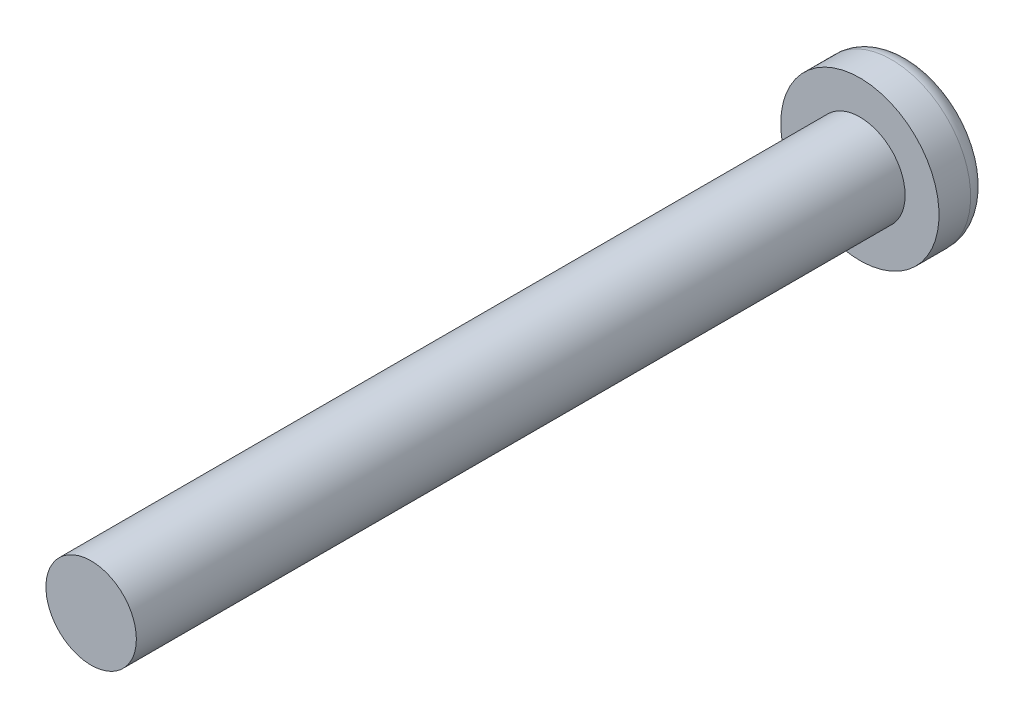
ISO-10303-21;
HEADER;
FILE_DESCRIPTION(('STEP AP214'),'2;1');
FILE_NAME('part.step','',(''),(''),'','','');
FILE_SCHEMA(('AUTOMOTIVE_DESIGN { 1 0 10303 214 1 1 1 1 }'));
ENDSEC;
DATA;
#1=APPLICATION_CONTEXT('core data for automotive mechanical design processes');
#2=APPLICATION_PROTOCOL_DEFINITION('international standard','automotive_design',2000,#1);
#3=PRODUCT_CONTEXT('',#1,'mechanical');
#4=PRODUCT('Part','Part','',(#3));
#5=PRODUCT_RELATED_PRODUCT_CATEGORY('part','',(#4));
#6=PRODUCT_DEFINITION_FORMATION('','',#4);
#7=PRODUCT_DEFINITION_CONTEXT('part definition',#1,'design');
#8=PRODUCT_DEFINITION('design','',#6,#7);
#9=PRODUCT_DEFINITION_SHAPE('','',#8);
#10=(LENGTH_UNIT() NAMED_UNIT(*) SI_UNIT(.MILLI.,.METRE.));
#11=(NAMED_UNIT(*) PLANE_ANGLE_UNIT() SI_UNIT($,.RADIAN.));
#12=(NAMED_UNIT(*) SI_UNIT($,.STERADIAN.) SOLID_ANGLE_UNIT());
#13=UNCERTAINTY_MEASURE_WITH_UNIT(LENGTH_MEASURE(1.E-05),#10,'distance_accuracy_value','');
#14=(GEOMETRIC_REPRESENTATION_CONTEXT(3) GLOBAL_UNCERTAINTY_ASSIGNED_CONTEXT((#13)) GLOBAL_UNIT_ASSIGNED_CONTEXT((#10,
#11,#12)) REPRESENTATION_CONTEXT('',''));
#15=CARTESIAN_POINT('',(0.,0.,0.));
#16=DIRECTION('',(0.,0.,1.));
#17=DIRECTION('',(1.,0.,0.));
#18=AXIS2_PLACEMENT_3D('',#15,#16,#17);
#19=CARTESIAN_POINT('',(0.,0.,85.));
#20=DIRECTION('',(0.,0.,-1.));
#21=DIRECTION('',(-1.,0.,0.));
#22=AXIS2_PLACEMENT_3D('',#19,#20,#21);
#23=CYLINDRICAL_SURFACE('',#22,5.);
#24=CARTESIAN_POINT('',(0.,0.,85.));
#25=DIRECTION('',(0.,0.,1.));
#26=DIRECTION('',(1.,0.,0.));
#27=AXIS2_PLACEMENT_3D('',#24,#25,#26);
#28=CIRCLE('',#27,5.);
#29=CARTESIAN_POINT('',(5.,0.,85.));
#30=VERTEX_POINT('',#29);
#31=EDGE_CURVE('E50',#30,#30,#28,.T.);
#32=ORIENTED_EDGE('',*,*,#31,.F.);
#33=EDGE_LOOP('',(#32));
#34=FACE_BOUND('',#33,.T.);
#35=CARTESIAN_POINT('',(0.,0.,0.));
#36=DIRECTION('',(0.,0.,1.));
#37=DIRECTION('',(1.,0.,0.));
#38=AXIS2_PLACEMENT_3D('',#35,#36,#37);
#39=CIRCLE('',#38,5.);
#40=CARTESIAN_POINT('',(5.,0.,0.));
#41=VERTEX_POINT('',#40);
#42=EDGE_CURVE('E55',#41,#41,#39,.T.);
#43=ORIENTED_EDGE('',*,*,#42,.T.);
#44=EDGE_LOOP('',(#43));
#45=FACE_BOUND('',#44,.T.);
#46=ADVANCED_FACE('F37',(#34,#45),#23,.T.);
#47=CARTESIAN_POINT('',(0.,0.,85.));
#48=DIRECTION('',(0.,0.,1.));
#49=DIRECTION('',(1.,0.,0.));
#50=AXIS2_PLACEMENT_3D('',#47,#48,#49);
#51=PLANE('',#50);
#52=ORIENTED_EDGE('',*,*,#31,.T.);
#53=EDGE_LOOP('',(#52));
#54=FACE_BOUND('',#53,.T.);
#55=ADVANCED_FACE('F82',(#54),#51,.T.);
#56=CARTESIAN_POINT('',(0.,0.,-5.5));
#57=DIRECTION('',(0.,0.,1.));
#58=DIRECTION('',(1.,0.,0.));
#59=AXIS2_PLACEMENT_3D('',#56,#57,#58);
#60=CYLINDRICAL_SURFACE('',#59,8.75);
#61=CARTESIAN_POINT('',(0.,0.,-3.5));
#62=DIRECTION('',(0.,0.,-1.));
#63=DIRECTION('',(-1.,0.,0.));
#64=AXIS2_PLACEMENT_3D('',#61,#62,#63);
#65=CIRCLE('',#64,8.75);
#66=CARTESIAN_POINT('',(-8.75,0.,-3.5));
#67=VERTEX_POINT('',#66);
#68=EDGE_CURVE('E10',#67,#67,#65,.F.);
#69=ORIENTED_EDGE('',*,*,#68,.T.);
#70=EDGE_LOOP('',(#69));
#71=FACE_BOUND('',#70,.T.);
#72=CARTESIAN_POINT('',(0.,0.,0.));
#73=DIRECTION('',(0.,0.,-1.));
#74=DIRECTION('',(-1.,0.,0.));
#75=AXIS2_PLACEMENT_3D('',#72,#73,#74);
#76=CIRCLE('',#75,8.75);
#77=CARTESIAN_POINT('',(-8.75,0.,0.));
#78=VERTEX_POINT('',#77);
#79=EDGE_CURVE('E60',#78,#78,#76,.T.);
#80=ORIENTED_EDGE('',*,*,#79,.T.);
#81=EDGE_LOOP('',(#80));
#82=FACE_BOUND('',#81,.T.);
#83=ADVANCED_FACE('F66',(#71,#82),#60,.T.);
#84=CARTESIAN_POINT('',(0.,0.,-5.5));
#85=DIRECTION('',(0.,0.,-1.));
#86=DIRECTION('',(-1.,0.,0.));
#87=AXIS2_PLACEMENT_3D('',#84,#85,#86);
#88=PLANE('',#87);
#89=CARTESIAN_POINT('',(0.,0.,-5.5));
#90=DIRECTION('',(0.,0.,-1.));
#91=DIRECTION('',(-1.,0.,0.));
#92=AXIS2_PLACEMENT_3D('',#89,#90,#91);
#93=CIRCLE('',#92,6.75);
#94=CARTESIAN_POINT('',(-6.75,0.,-5.5));
#95=VERTEX_POINT('',#94);
#96=EDGE_CURVE('E45',#95,#95,#93,.T.);
#97=ORIENTED_EDGE('',*,*,#96,.T.);
#98=EDGE_LOOP('',(#97));
#99=FACE_BOUND('',#98,.T.);
#100=ADVANCED_FACE('F70',(#99),#88,.T.);
#101=CARTESIAN_POINT('',(0.,0.,0.));
#102=DIRECTION('',(0.,0.,-1.));
#103=DIRECTION('',(-1.,0.,0.));
#104=AXIS2_PLACEMENT_3D('',#101,#102,#103);
#105=PLANE('',#104);
#106=ORIENTED_EDGE('',*,*,#42,.F.);
#107=EDGE_LOOP('',(#106));
#108=FACE_BOUND('',#107,.T.);
#109=ORIENTED_EDGE('',*,*,#79,.F.);
#110=EDGE_LOOP('',(#109));
#111=FACE_BOUND('',#110,.T.);
#112=ADVANCED_FACE('F68',(#108,#111),#105,.F.);
#113=CARTESIAN_POINT('',(0.,0.,-3.5));
#114=DIRECTION('',(0.,0.,-1.));
#115=DIRECTION('',(-1.,0.,0.));
#116=AXIS2_PLACEMENT_3D('',#113,#114,#115);
#117=TOROIDAL_SURFACE('',#116,6.75,2.);
#118=ORIENTED_EDGE('',*,*,#68,.F.);
#119=EDGE_LOOP('',(#118));
#120=FACE_BOUND('',#119,.T.);
#121=ORIENTED_EDGE('',*,*,#96,.F.);
#122=EDGE_LOOP('',(#121));
#123=FACE_BOUND('',#122,.T.);
#124=ADVANCED_FACE('F39',(#120,#123),#117,.T.);
#125=CLOSED_SHELL('',(#46,#55,#83,#100,#112,#124));
#126=MANIFOLD_SOLID_BREP('B2',#125);
#127=ADVANCED_BREP_SHAPE_REPRESENTATION('',(#18,#126),#14);
#128=SHAPE_DEFINITION_REPRESENTATION(#9,#127);
ENDSEC;
END-ISO-10303-21;
